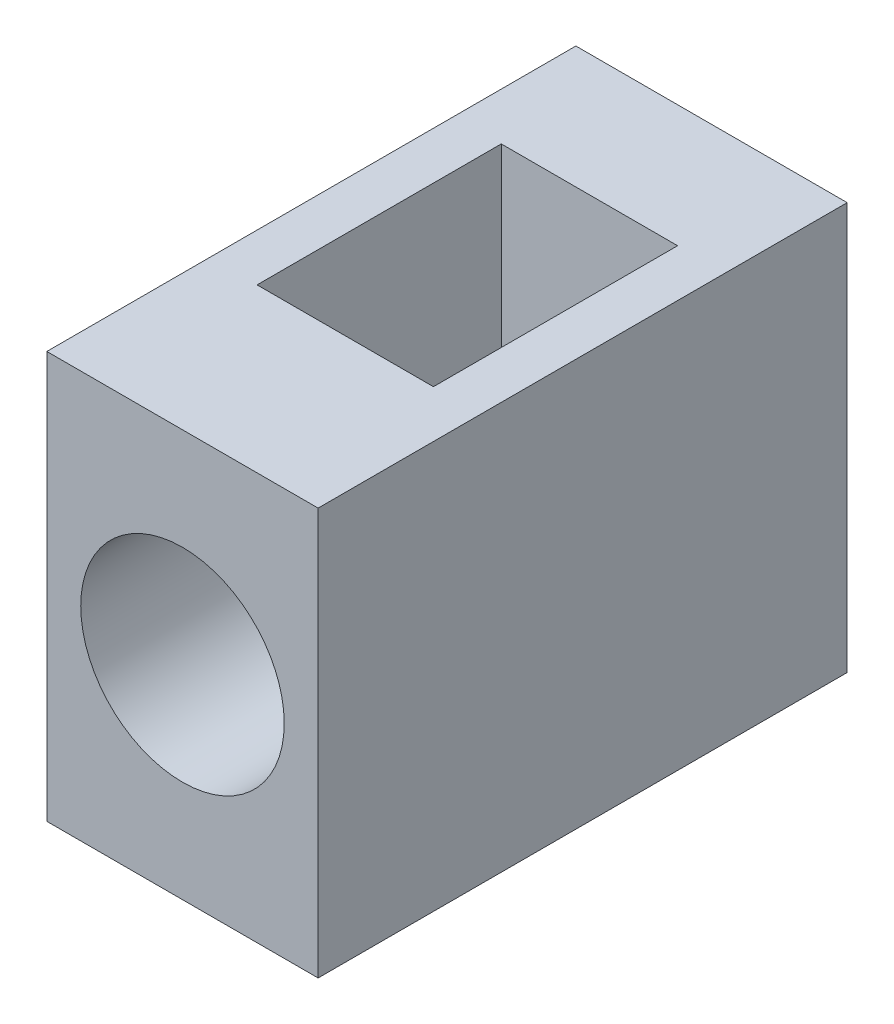
ISO-10303-21;
HEADER;
FILE_DESCRIPTION(('STEP AP214'),'2;1');
FILE_NAME('part.step','',(''),(''),'','','');
FILE_SCHEMA(('AUTOMOTIVE_DESIGN { 1 0 10303 214 1 1 1 1 }'));
ENDSEC;
DATA;
#1=APPLICATION_CONTEXT('core data for automotive mechanical design processes');
#2=APPLICATION_PROTOCOL_DEFINITION('international standard','automotive_design',2000,#1);
#3=PRODUCT_CONTEXT('',#1,'mechanical');
#4=PRODUCT('Part','Part','',(#3));
#5=PRODUCT_RELATED_PRODUCT_CATEGORY('part','',(#4));
#6=PRODUCT_DEFINITION_FORMATION('','',#4);
#7=PRODUCT_DEFINITION_CONTEXT('part definition',#1,'design');
#8=PRODUCT_DEFINITION('design','',#6,#7);
#9=PRODUCT_DEFINITION_SHAPE('','',#8);
#10=(LENGTH_UNIT() NAMED_UNIT(*) SI_UNIT(.MILLI.,.METRE.));
#11=(NAMED_UNIT(*) PLANE_ANGLE_UNIT() SI_UNIT($,.RADIAN.));
#12=(NAMED_UNIT(*) SI_UNIT($,.STERADIAN.) SOLID_ANGLE_UNIT());
#13=UNCERTAINTY_MEASURE_WITH_UNIT(LENGTH_MEASURE(1.E-05),#10,'distance_accuracy_value','');
#14=(GEOMETRIC_REPRESENTATION_CONTEXT(3) GLOBAL_UNCERTAINTY_ASSIGNED_CONTEXT((#13)) GLOBAL_UNIT_ASSIGNED_CONTEXT((#10,
#11,#12)) REPRESENTATION_CONTEXT('',''));
#15=CARTESIAN_POINT('',(0.,0.,0.));
#16=DIRECTION('',(0.,0.,1.));
#17=DIRECTION('',(1.,0.,0.));
#18=AXIS2_PLACEMENT_3D('',#15,#16,#17);
#19=CARTESIAN_POINT('',(-1.27,-0.175,0.65));
#20=DIRECTION('',(0.,0.,-1.));
#21=DIRECTION('',(0.,1.,0.));
#22=AXIS2_PLACEMENT_3D('',#19,#20,#21);
#23=PLANE('',#22);
#24=CARTESIAN_POINT('',(-1.27,-0.175,0.65));
#25=DIRECTION('',(0.,0.,1.));
#26=DIRECTION('',(0.,-1.,0.));
#27=AXIS2_PLACEMENT_3D('',#24,#25,#26);
#28=CIRCLE('',#27,0.75);
#29=CARTESIAN_POINT('',(-1.92,0.199165738677197,0.65));
#30=VERTEX_POINT('',#29);
#31=CARTESIAN_POINT('',(-1.92,-0.549165738677197,0.65));
#32=VERTEX_POINT('',#31);
#33=EDGE_CURVE('E115',#30,#32,#28,.T.);
#34=ORIENTED_EDGE('',*,*,#33,.T.);
#35=DIRECTION('',(0.,1.,0.));
#36=VECTOR('',#35,1.);
#37=CARTESIAN_POINT('',(-1.92,3.636308689956,0.65));
#38=LINE('',#37,#36);
#39=EDGE_CURVE('E150',#30,#32,#38,.F.);
#40=ORIENTED_EDGE('',*,*,#39,.F.);
#41=EDGE_LOOP('',(#34,#40));
#42=FACE_BOUND('',#41,.T.);
#43=ADVANCED_FACE('F17',(#42),#23,.F.);
#44=CARTESIAN_POINT('',(-1.27,-0.175,0.65));
#45=DIRECTION('',(0.,0.,-1.));
#46=DIRECTION('',(0.,1.,0.));
#47=AXIS2_PLACEMENT_3D('',#44,#45,#46);
#48=PLANE('',#47);
#49=DIRECTION('',(0.,1.,0.));
#50=VECTOR('',#49,1.);
#51=CARTESIAN_POINT('',(-0.62,3.636308689956,0.65));
#52=LINE('',#51,#50);
#53=CARTESIAN_POINT('',(-0.62,-0.549165738677196,0.65));
#54=VERTEX_POINT('',#53);
#55=CARTESIAN_POINT('',(-0.62,0.199165738677197,0.65));
#56=VERTEX_POINT('',#55);
#57=EDGE_CURVE('E102',#54,#56,#52,.T.);
#58=ORIENTED_EDGE('',*,*,#57,.F.);
#59=CARTESIAN_POINT('',(-1.27,-0.175,0.65));
#60=DIRECTION('',(0.,0.,1.));
#61=DIRECTION('',(0.,-1.,0.));
#62=AXIS2_PLACEMENT_3D('',#59,#60,#61);
#63=CIRCLE('',#62,0.75);
#64=EDGE_CURVE('E20',#54,#56,#63,.T.);
#65=ORIENTED_EDGE('',*,*,#64,.T.);
#66=EDGE_LOOP('',(#58,#65));
#67=FACE_BOUND('',#66,.T.);
#68=ADVANCED_FACE('F124',(#67),#48,.F.);
#69=CARTESIAN_POINT('',(-0.62,3.636308689956,-0.85));
#70=DIRECTION('',(0.,0.,1.));
#71=DIRECTION('',(0.,-1.,0.));
#72=AXIS2_PLACEMENT_3D('',#69,#70,#71);
#73=PLANE('',#72);
#74=DIRECTION('',(0.,1.,0.));
#75=VECTOR('',#74,1.);
#76=CARTESIAN_POINT('',(-0.619999999999999,3.636308689956,-0.85));
#77=LINE('',#76,#75);
#78=CARTESIAN_POINT('',(-0.62,1.325,-0.850000000000001));
#79=VERTEX_POINT('',#78);
#80=CARTESIAN_POINT('',(-0.62,-1.675,-0.850000000000002));
#81=VERTEX_POINT('',#80);
#82=EDGE_CURVE('E196',#79,#81,#77,.F.);
#83=ORIENTED_EDGE('',*,*,#82,.F.);
#84=DIRECTION('',(1.,0.,0.));
#85=VECTOR('',#84,1.);
#86=CARTESIAN_POINT('',(-0.62,1.325,-0.850000000000001));
#87=LINE('',#86,#85);
#88=CARTESIAN_POINT('',(-1.92,1.325,-0.850000000000001));
#89=VERTEX_POINT('',#88);
#90=EDGE_CURVE('E116',#79,#89,#87,.F.);
#91=ORIENTED_EDGE('',*,*,#90,.T.);
#92=DIRECTION('',(0.,1.,0.));
#93=VECTOR('',#92,1.);
#94=CARTESIAN_POINT('',(-1.92,3.636308689956,-0.85));
#95=LINE('',#94,#93);
#96=CARTESIAN_POINT('',(-1.92,-1.675,-0.850000000000002));
#97=VERTEX_POINT('',#96);
#98=EDGE_CURVE('E149',#97,#89,#95,.T.);
#99=ORIENTED_EDGE('',*,*,#98,.F.);
#100=DIRECTION('',(1.,0.,0.));
#101=VECTOR('',#100,1.);
#102=CARTESIAN_POINT('',(-0.62,-1.675,-0.850000000000003));
#103=LINE('',#102,#101);
#104=EDGE_CURVE('E201',#97,#81,#103,.T.);
#105=ORIENTED_EDGE('',*,*,#104,.T.);
#106=EDGE_LOOP('',(#83,#91,#99,#105));
#107=FACE_BOUND('',#106,.T.);
#108=ADVANCED_FACE('F234',(#107),#73,.T.);
#109=CARTESIAN_POINT('',(-1.27,-0.175,0.65));
#110=DIRECTION('',(0.,0.,1.));
#111=DIRECTION('',(0.,-1.,0.));
#112=AXIS2_PLACEMENT_3D('',#109,#110,#111);
#113=CYLINDRICAL_SURFACE('',#112,0.75);
#114=CARTESIAN_POINT('',(-1.27,-0.175000000000001,2.15));
#115=DIRECTION('',(0.,0.,1.));
#116=DIRECTION('',(0.,-1.,0.));
#117=AXIS2_PLACEMENT_3D('',#114,#115,#116);
#118=CIRCLE('',#117,0.75);
#119=CARTESIAN_POINT('',(-1.27,-0.925000000000001,2.15));
#120=VERTEX_POINT('',#119);
#121=EDGE_CURVE('E172',#120,#120,#118,.F.);
#122=ORIENTED_EDGE('',*,*,#121,.F.);
#123=EDGE_LOOP('',(#122));
#124=FACE_BOUND('',#123,.T.);
#125=DIRECTION('',(0.,0.,-1.));
#126=VECTOR('',#125,1.);
#127=CARTESIAN_POINT('',(-1.92,0.199165738677,-0.85));
#128=LINE('',#127,#126);
#129=CARTESIAN_POINT('',(-1.92,0.199165738677197,0.95));
#130=VERTEX_POINT('',#129);
#131=EDGE_CURVE('E156',#130,#30,#128,.T.);
#132=ORIENTED_EDGE('',*,*,#131,.F.);
#133=CARTESIAN_POINT('',(-1.27,-0.175,0.95));
#134=DIRECTION('',(0.,0.,1.));
#135=DIRECTION('',(0.,-1.,0.));
#136=AXIS2_PLACEMENT_3D('',#133,#134,#135);
#137=CIRCLE('',#136,0.75);
#138=CARTESIAN_POINT('',(-0.62,0.199165738677197,0.95));
#139=VERTEX_POINT('',#138);
#140=EDGE_CURVE('E162',#139,#130,#137,.T.);
#141=ORIENTED_EDGE('',*,*,#140,.F.);
#142=DIRECTION('',(0.,0.,1.));
#143=VECTOR('',#142,1.);
#144=CARTESIAN_POINT('',(-0.62,0.199165738677,0.95));
#145=LINE('',#144,#143);
#146=EDGE_CURVE('E113',#56,#139,#145,.T.);
#147=ORIENTED_EDGE('',*,*,#146,.F.);
#148=ORIENTED_EDGE('',*,*,#64,.F.);
#149=DIRECTION('',(0.,0.,1.));
#150=VECTOR('',#149,1.);
#151=CARTESIAN_POINT('',(-0.62,-0.549165738677,0.95));
#152=LINE('',#151,#150);
#153=CARTESIAN_POINT('',(-0.62,-0.549165738677197,0.95));
#154=VERTEX_POINT('',#153);
#155=EDGE_CURVE('E111',#154,#54,#152,.F.);
#156=ORIENTED_EDGE('',*,*,#155,.F.);
#157=CARTESIAN_POINT('',(-1.27,-0.175,0.95));
#158=DIRECTION('',(0.,0.,1.));
#159=DIRECTION('',(0.,-1.,0.));
#160=AXIS2_PLACEMENT_3D('',#157,#158,#159);
#161=CIRCLE('',#160,0.75);
#162=CARTESIAN_POINT('',(-1.92,-0.549165738677197,0.949999999999999));
#163=VERTEX_POINT('',#162);
#164=EDGE_CURVE('E133',#163,#154,#161,.T.);
#165=ORIENTED_EDGE('',*,*,#164,.F.);
#166=DIRECTION('',(0.,0.,-1.));
#167=VECTOR('',#166,1.);
#168=CARTESIAN_POINT('',(-1.92,-0.549165738677,-0.85));
#169=LINE('',#168,#167);
#170=EDGE_CURVE('E147',#32,#163,#169,.F.);
#171=ORIENTED_EDGE('',*,*,#170,.F.);
#172=ORIENTED_EDGE('',*,*,#33,.F.);
#173=EDGE_LOOP('',(#132,#141,#147,#148,#156,#165,#171,#172));
#174=FACE_BOUND('',#173,.T.);
#175=ADVANCED_FACE('F109',(#124,#174),#113,.F.);
#176=CARTESIAN_POINT('',(-1.92,3.636308689956,0.95));
#177=DIRECTION('',(0.,0.,-1.));
#178=DIRECTION('',(0.,1.,0.));
#179=AXIS2_PLACEMENT_3D('',#176,#177,#178);
#180=PLANE('',#179);
#181=DIRECTION('',(0.,1.,0.));
#182=VECTOR('',#181,1.);
#183=CARTESIAN_POINT('',(-1.92,3.636308689956,0.95));
#184=LINE('',#183,#182);
#185=CARTESIAN_POINT('',(-1.92,1.325,0.95));
#186=VERTEX_POINT('',#185);
#187=EDGE_CURVE('E159',#186,#130,#184,.F.);
#188=ORIENTED_EDGE('',*,*,#187,.F.);
#189=DIRECTION('',(1.,0.,0.));
#190=VECTOR('',#189,1.);
#191=CARTESIAN_POINT('',(-0.27,1.325,0.95));
#192=LINE('',#191,#190);
#193=CARTESIAN_POINT('',(-0.62,1.325,0.95));
#194=VERTEX_POINT('',#193);
#195=EDGE_CURVE('E169',#194,#186,#192,.F.);
#196=ORIENTED_EDGE('',*,*,#195,.F.);
#197=DIRECTION('',(0.,1.,0.));
#198=VECTOR('',#197,1.);
#199=CARTESIAN_POINT('',(-0.62,3.636308689956,0.95));
#200=LINE('',#199,#198);
#201=EDGE_CURVE('E126',#139,#194,#200,.T.);
#202=ORIENTED_EDGE('',*,*,#201,.F.);
#203=ORIENTED_EDGE('',*,*,#140,.T.);
#204=EDGE_LOOP('',(#188,#196,#202,#203));
#205=FACE_BOUND('',#204,.T.);
#206=ADVANCED_FACE('F242',(#205),#180,.T.);
#207=CARTESIAN_POINT('',(-2.27,-0.175,0.2));
#208=DIRECTION('',(-1.,0.,0.));
#209=DIRECTION('',(0.,0.,1.));
#210=AXIS2_PLACEMENT_3D('',#207,#208,#209);
#211=PLANE('',#210);
#212=DIRECTION('',(0.,0.,1.));
#213=VECTOR('',#212,1.);
#214=CARTESIAN_POINT('',(-2.27,1.325,2.15));
#215=LINE('',#214,#213);
#216=CARTESIAN_POINT('',(-2.27,1.325,-1.75));
#217=VERTEX_POINT('',#216);
#218=CARTESIAN_POINT('',(-2.27,1.325,2.15));
#219=VERTEX_POINT('',#218);
#220=EDGE_CURVE('E175',#217,#219,#215,.T.);
#221=ORIENTED_EDGE('',*,*,#220,.F.);
#222=DIRECTION('',(0.,1.,0.));
#223=VECTOR('',#222,1.);
#224=CARTESIAN_POINT('',(-2.27,1.325,-1.75));
#225=LINE('',#224,#223);
#226=CARTESIAN_POINT('',(-2.27,-1.675,-1.75));
#227=VERTEX_POINT('',#226);
#228=EDGE_CURVE('E208',#227,#217,#225,.T.);
#229=ORIENTED_EDGE('',*,*,#228,.F.);
#230=DIRECTION('',(0.,0.,-1.));
#231=VECTOR('',#230,1.);
#232=CARTESIAN_POINT('',(-2.27,-1.675,-1.75));
#233=LINE('',#232,#231);
#234=CARTESIAN_POINT('',(-2.27,-1.675,2.15));
#235=VERTEX_POINT('',#234);
#236=EDGE_CURVE('E402',#235,#227,#233,.T.);
#237=ORIENTED_EDGE('',*,*,#236,.F.);
#238=DIRECTION('',(0.,-1.,0.));
#239=VECTOR('',#238,1.);
#240=CARTESIAN_POINT('',(-2.27,-1.675,2.15));
#241=LINE('',#240,#239);
#242=EDGE_CURVE('E176',#219,#235,#241,.T.);
#243=ORIENTED_EDGE('',*,*,#242,.F.);
#244=EDGE_LOOP('',(#221,#229,#237,#243));
#245=FACE_BOUND('',#244,.T.);
#246=ADVANCED_FACE('F271',(#245),#211,.T.);
#247=CARTESIAN_POINT('',(-1.92,3.636308689956,-0.85));
#248=DIRECTION('',(1.,0.,0.));
#249=DIRECTION('',(0.,0.,-1.));
#250=AXIS2_PLACEMENT_3D('',#247,#248,#249);
#251=PLANE('',#250);
#252=ORIENTED_EDGE('',*,*,#98,.T.);
#253=DIRECTION('',(0.,0.,1.));
#254=VECTOR('',#253,1.);
#255=CARTESIAN_POINT('',(-1.92,1.325,2.15));
#256=LINE('',#255,#254);
#257=EDGE_CURVE('E165',#186,#89,#256,.F.);
#258=ORIENTED_EDGE('',*,*,#257,.F.);
#259=ORIENTED_EDGE('',*,*,#187,.T.);
#260=ORIENTED_EDGE('',*,*,#131,.T.);
#261=ORIENTED_EDGE('',*,*,#39,.T.);
#262=ORIENTED_EDGE('',*,*,#170,.T.);
#263=DIRECTION('',(0.,1.,0.));
#264=VECTOR('',#263,1.);
#265=CARTESIAN_POINT('',(-1.92,3.636308689956,0.95));
#266=LINE('',#265,#264);
#267=CARTESIAN_POINT('',(-1.92,-1.675,0.949999999999998));
#268=VERTEX_POINT('',#267);
#269=EDGE_CURVE('E178',#268,#163,#266,.T.);
#270=ORIENTED_EDGE('',*,*,#269,.F.);
#271=DIRECTION('',(0.,0.,-1.));
#272=VECTOR('',#271,1.);
#273=CARTESIAN_POINT('',(-1.92,-1.675,-1.75));
#274=LINE('',#273,#272);
#275=EDGE_CURVE('E139',#97,#268,#274,.F.);
#276=ORIENTED_EDGE('',*,*,#275,.F.);
#277=EDGE_LOOP('',(#252,#258,#259,#260,#261,#262,#270,#276));
#278=FACE_BOUND('',#277,.T.);
#279=ADVANCED_FACE('F187',(#278),#251,.T.);
#280=CARTESIAN_POINT('',(-1.92,3.636308689956,0.95));
#281=DIRECTION('',(0.,0.,-1.));
#282=DIRECTION('',(0.,1.,0.));
#283=AXIS2_PLACEMENT_3D('',#280,#281,#282);
#284=PLANE('',#283);
#285=DIRECTION('',(0.,1.,0.));
#286=VECTOR('',#285,1.);
#287=CARTESIAN_POINT('',(-0.62,3.636308689956,0.95));
#288=LINE('',#287,#286);
#289=CARTESIAN_POINT('',(-0.62,-1.675,0.95));
#290=VERTEX_POINT('',#289);
#291=EDGE_CURVE('E122',#290,#154,#288,.T.);
#292=ORIENTED_EDGE('',*,*,#291,.F.);
#293=DIRECTION('',(1.,0.,0.));
#294=VECTOR('',#293,1.);
#295=CARTESIAN_POINT('',(-0.27,-1.675,0.95));
#296=LINE('',#295,#294);
#297=EDGE_CURVE('E136',#268,#290,#296,.T.);
#298=ORIENTED_EDGE('',*,*,#297,.F.);
#299=ORIENTED_EDGE('',*,*,#269,.T.);
#300=ORIENTED_EDGE('',*,*,#164,.T.);
#301=EDGE_LOOP('',(#292,#298,#299,#300));
#302=FACE_BOUND('',#301,.T.);
#303=ADVANCED_FACE('F191',(#302),#284,.T.);
#304=CARTESIAN_POINT('',(-0.62,3.636308689956,0.95));
#305=DIRECTION('',(-1.,0.,0.));
#306=DIRECTION('',(0.,0.,1.));
#307=AXIS2_PLACEMENT_3D('',#304,#305,#306);
#308=PLANE('',#307);
#309=ORIENTED_EDGE('',*,*,#82,.T.);
#310=DIRECTION('',(0.,0.,-1.));
#311=VECTOR('',#310,1.);
#312=CARTESIAN_POINT('',(-0.62,-1.675,-1.75));
#313=LINE('',#312,#311);
#314=EDGE_CURVE('E138',#290,#81,#313,.T.);
#315=ORIENTED_EDGE('',*,*,#314,.F.);
#316=ORIENTED_EDGE('',*,*,#291,.T.);
#317=ORIENTED_EDGE('',*,*,#155,.T.);
#318=ORIENTED_EDGE('',*,*,#57,.T.);
#319=ORIENTED_EDGE('',*,*,#146,.T.);
#320=ORIENTED_EDGE('',*,*,#201,.T.);
#321=DIRECTION('',(0.,0.,1.));
#322=VECTOR('',#321,1.);
#323=CARTESIAN_POINT('',(-0.62,1.325,2.15));
#324=LINE('',#323,#322);
#325=EDGE_CURVE('E168',#79,#194,#324,.T.);
#326=ORIENTED_EDGE('',*,*,#325,.F.);
#327=EDGE_LOOP('',(#309,#315,#316,#317,#318,#319,#320,#326));
#328=FACE_BOUND('',#327,.T.);
#329=ADVANCED_FACE('F119',(#328),#308,.T.);
#330=CARTESIAN_POINT('',(-0.27,-1.675,2.15));
#331=DIRECTION('',(0.,0.,1.));
#332=DIRECTION('',(0.,-1.,0.));
#333=AXIS2_PLACEMENT_3D('',#330,#331,#332);
#334=PLANE('',#333);
#335=ORIENTED_EDGE('',*,*,#121,.T.);
#336=EDGE_LOOP('',(#335));
#337=FACE_BOUND('',#336,.T.);
#338=DIRECTION('',(0.,1.,0.));
#339=VECTOR('',#338,1.);
#340=CARTESIAN_POINT('',(-0.27,-0.175,2.15));
#341=LINE('',#340,#339);
#342=CARTESIAN_POINT('',(-0.27,-1.675,2.15));
#343=VERTEX_POINT('',#342);
#344=CARTESIAN_POINT('',(-0.27,1.325,2.15));
#345=VERTEX_POINT('',#344);
#346=EDGE_CURVE('E144',#343,#345,#341,.T.);
#347=ORIENTED_EDGE('',*,*,#346,.T.);
#348=DIRECTION('',(1.,0.,0.));
#349=VECTOR('',#348,1.);
#350=CARTESIAN_POINT('',(-0.27,1.325,2.15));
#351=LINE('',#350,#349);
#352=EDGE_CURVE('E210',#219,#345,#351,.T.);
#353=ORIENTED_EDGE('',*,*,#352,.F.);
#354=ORIENTED_EDGE('',*,*,#242,.T.);
#355=DIRECTION('',(1.,0.,0.));
#356=VECTOR('',#355,1.);
#357=CARTESIAN_POINT('',(-0.27,-1.675,2.15));
#358=LINE('',#357,#356);
#359=EDGE_CURVE('E152',#343,#235,#358,.F.);
#360=ORIENTED_EDGE('',*,*,#359,.F.);
#361=EDGE_LOOP('',(#347,#353,#354,#360));
#362=FACE_BOUND('',#361,.T.);
#363=ADVANCED_FACE('F261',(#337,#362),#334,.T.);
#364=CARTESIAN_POINT('',(-0.27,1.325,2.15));
#365=DIRECTION('',(0.,1.,0.));
#366=DIRECTION('',(0.,0.,1.));
#367=AXIS2_PLACEMENT_3D('',#364,#365,#366);
#368=PLANE('',#367);
#369=ORIENTED_EDGE('',*,*,#90,.F.);
#370=ORIENTED_EDGE('',*,*,#325,.T.);
#371=ORIENTED_EDGE('',*,*,#195,.T.);
#372=ORIENTED_EDGE('',*,*,#257,.T.);
#373=EDGE_LOOP('',(#369,#370,#371,#372));
#374=FACE_BOUND('',#373,.T.);
#375=DIRECTION('',(0.,0.,1.));
#376=VECTOR('',#375,1.);
#377=CARTESIAN_POINT('',(-0.27,1.325,0.2));
#378=LINE('',#377,#376);
#379=CARTESIAN_POINT('',(-0.27,1.325,-1.75));
#380=VERTEX_POINT('',#379);
#381=EDGE_CURVE('E400',#345,#380,#378,.F.);
#382=ORIENTED_EDGE('',*,*,#381,.T.);
#383=DIRECTION('',(1.,0.,0.));
#384=VECTOR('',#383,1.);
#385=CARTESIAN_POINT('',(-0.27,1.325,-1.75));
#386=LINE('',#385,#384);
#387=EDGE_CURVE('E399',#217,#380,#386,.T.);
#388=ORIENTED_EDGE('',*,*,#387,.F.);
#389=ORIENTED_EDGE('',*,*,#220,.T.);
#390=ORIENTED_EDGE('',*,*,#352,.T.);
#391=EDGE_LOOP('',(#382,#388,#389,#390));
#392=FACE_BOUND('',#391,.T.);
#393=ADVANCED_FACE('F233',(#374,#392),#368,.T.);
#394=CARTESIAN_POINT('',(-0.27,1.325,-1.75));
#395=DIRECTION('',(0.,0.,-1.));
#396=DIRECTION('',(0.,1.,0.));
#397=AXIS2_PLACEMENT_3D('',#394,#395,#396);
#398=PLANE('',#397);
#399=DIRECTION('',(0.,1.,0.));
#400=VECTOR('',#399,1.);
#401=CARTESIAN_POINT('',(-0.27,-0.175,-1.75));
#402=LINE('',#401,#400);
#403=CARTESIAN_POINT('',(-0.27,-1.675,-1.75));
#404=VERTEX_POINT('',#403);
#405=EDGE_CURVE('E26',#380,#404,#402,.F.);
#406=ORIENTED_EDGE('',*,*,#405,.T.);
#407=DIRECTION('',(1.,0.,0.));
#408=VECTOR('',#407,1.);
#409=CARTESIAN_POINT('',(-0.27,-1.675,-1.75));
#410=LINE('',#409,#408);
#411=EDGE_CURVE('E34',#227,#404,#410,.T.);
#412=ORIENTED_EDGE('',*,*,#411,.F.);
#413=ORIENTED_EDGE('',*,*,#228,.T.);
#414=ORIENTED_EDGE('',*,*,#387,.T.);
#415=EDGE_LOOP('',(#406,#412,#413,#414));
#416=FACE_BOUND('',#415,.T.);
#417=ADVANCED_FACE('F252',(#416),#398,.T.);
#418=CARTESIAN_POINT('',(-0.27,-1.675,-1.75));
#419=DIRECTION('',(0.,-1.,0.));
#420=DIRECTION('',(0.,0.,-1.));
#421=AXIS2_PLACEMENT_3D('',#418,#419,#420);
#422=PLANE('',#421);
#423=ORIENTED_EDGE('',*,*,#297,.T.);
#424=ORIENTED_EDGE('',*,*,#314,.T.);
#425=ORIENTED_EDGE('',*,*,#104,.F.);
#426=ORIENTED_EDGE('',*,*,#275,.T.);
#427=EDGE_LOOP('',(#423,#424,#425,#426));
#428=FACE_BOUND('',#427,.T.);
#429=DIRECTION('',(0.,0.,1.));
#430=VECTOR('',#429,1.);
#431=CARTESIAN_POINT('',(-0.27,-1.675,0.2));
#432=LINE('',#431,#430);
#433=EDGE_CURVE('E11',#404,#343,#432,.T.);
#434=ORIENTED_EDGE('',*,*,#433,.T.);
#435=ORIENTED_EDGE('',*,*,#359,.T.);
#436=ORIENTED_EDGE('',*,*,#236,.T.);
#437=ORIENTED_EDGE('',*,*,#411,.T.);
#438=EDGE_LOOP('',(#434,#435,#436,#437));
#439=FACE_BOUND('',#438,.T.);
#440=ADVANCED_FACE('F230',(#428,#439),#422,.T.);
#441=CARTESIAN_POINT('',(-0.27,-0.175,0.2));
#442=DIRECTION('',(-1.,0.,0.));
#443=DIRECTION('',(0.,0.,1.));
#444=AXIS2_PLACEMENT_3D('',#441,#442,#443);
#445=PLANE('',#444);
#446=ORIENTED_EDGE('',*,*,#405,.F.);
#447=ORIENTED_EDGE('',*,*,#381,.F.);
#448=ORIENTED_EDGE('',*,*,#346,.F.);
#449=ORIENTED_EDGE('',*,*,#433,.F.);
#450=EDGE_LOOP('',(#446,#447,#448,#449));
#451=FACE_BOUND('',#450,.T.);
#452=ADVANCED_FACE('F245',(#451),#445,.F.);
#453=CLOSED_SHELL('',(#43,#68,#108,#175,#206,#246,#279,#303,#329,#363,#393,#417,#440,#452));
#454=MANIFOLD_SOLID_BREP('B1',#453);
#455=ADVANCED_BREP_SHAPE_REPRESENTATION('',(#18,#454),#14);
#456=SHAPE_DEFINITION_REPRESENTATION(#9,#455);
ENDSEC;
END-ISO-10303-21;
